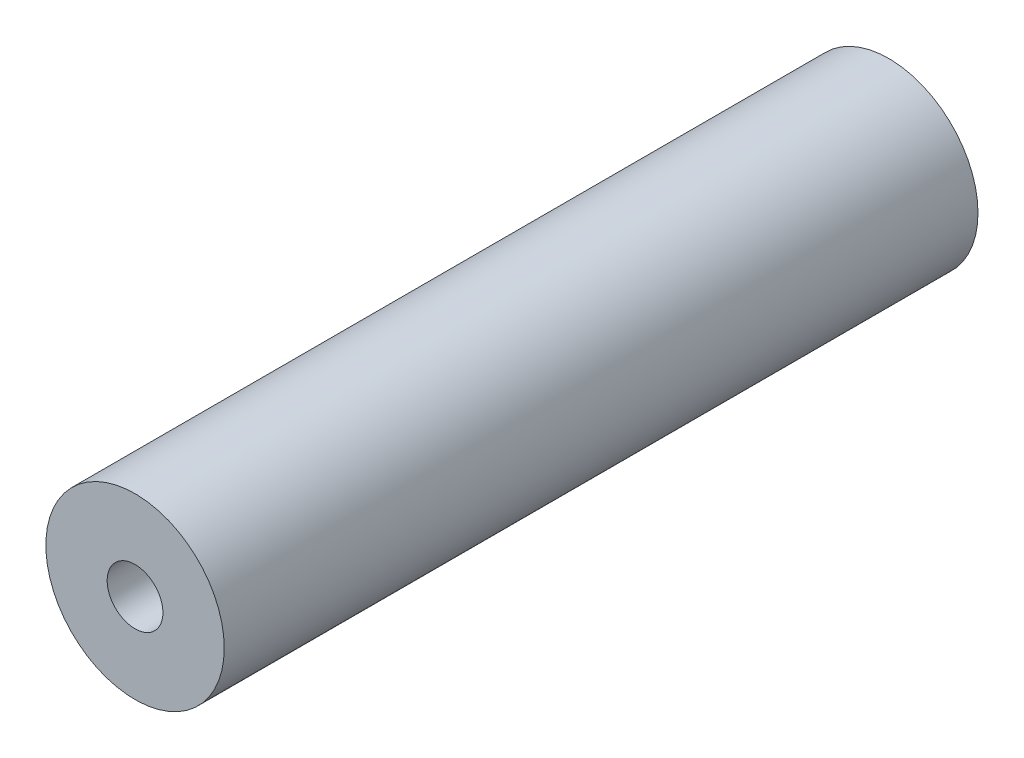
ISO-10303-21;
HEADER;
FILE_DESCRIPTION(('STEP AP214'),'2;1');
FILE_NAME('part.step','',(''),(''),'','','');
FILE_SCHEMA(('AUTOMOTIVE_DESIGN { 1 0 10303 214 1 1 1 1 }'));
ENDSEC;
DATA;
#1=APPLICATION_CONTEXT('core data for automotive mechanical design processes');
#2=APPLICATION_PROTOCOL_DEFINITION('international standard','automotive_design',2000,#1);
#3=PRODUCT_CONTEXT('',#1,'mechanical');
#4=PRODUCT('Part','Part','',(#3));
#5=PRODUCT_RELATED_PRODUCT_CATEGORY('part','',(#4));
#6=PRODUCT_DEFINITION_FORMATION('','',#4);
#7=PRODUCT_DEFINITION_CONTEXT('part definition',#1,'design');
#8=PRODUCT_DEFINITION('design','',#6,#7);
#9=PRODUCT_DEFINITION_SHAPE('','',#8);
#10=(LENGTH_UNIT() NAMED_UNIT(*) SI_UNIT(.MILLI.,.METRE.));
#11=(NAMED_UNIT(*) PLANE_ANGLE_UNIT() SI_UNIT($,.RADIAN.));
#12=(NAMED_UNIT(*) SI_UNIT($,.STERADIAN.) SOLID_ANGLE_UNIT());
#13=UNCERTAINTY_MEASURE_WITH_UNIT(LENGTH_MEASURE(1.E-05),#10,'distance_accuracy_value','');
#14=(GEOMETRIC_REPRESENTATION_CONTEXT(3) GLOBAL_UNCERTAINTY_ASSIGNED_CONTEXT((#13)) GLOBAL_UNIT_ASSIGNED_CONTEXT((#10,
#11,#12)) REPRESENTATION_CONTEXT('',''));
#15=CARTESIAN_POINT('',(0.,0.,0.));
#16=DIRECTION('',(0.,0.,1.));
#17=DIRECTION('',(1.,0.,0.));
#18=AXIS2_PLACEMENT_3D('',#15,#16,#17);
#19=CARTESIAN_POINT('',(0.,0.,33.8));
#20=DIRECTION('',(0.,0.,-1.));
#21=DIRECTION('',(-1.,0.,0.));
#22=AXIS2_PLACEMENT_3D('',#19,#20,#21);
#23=CYLINDRICAL_SURFACE('',#22,4.);
#24=CARTESIAN_POINT('',(0.,0.,33.8));
#25=DIRECTION('',(0.,0.,1.));
#26=DIRECTION('',(1.,0.,0.));
#27=AXIS2_PLACEMENT_3D('',#24,#25,#26);
#28=CIRCLE('',#27,4.);
#29=CARTESIAN_POINT('',(4.,0.,33.8));
#30=VERTEX_POINT('',#29);
#31=EDGE_CURVE('E10',#30,#30,#28,.T.);
#32=ORIENTED_EDGE('',*,*,#31,.F.);
#33=EDGE_LOOP('',(#32));
#34=FACE_BOUND('',#33,.T.);
#35=CARTESIAN_POINT('',(0.,0.,0.));
#36=DIRECTION('',(0.,0.,1.));
#37=DIRECTION('',(1.,0.,0.));
#38=AXIS2_PLACEMENT_3D('',#35,#36,#37);
#39=CIRCLE('',#38,4.);
#40=CARTESIAN_POINT('',(4.,0.,0.));
#41=VERTEX_POINT('',#40);
#42=EDGE_CURVE('E46',#41,#41,#39,.T.);
#43=ORIENTED_EDGE('',*,*,#42,.T.);
#44=EDGE_LOOP('',(#43));
#45=FACE_BOUND('',#44,.T.);
#46=ADVANCED_FACE('F43',(#34,#45),#23,.T.);
#47=CARTESIAN_POINT('',(0.,0.,33.8));
#48=DIRECTION('',(0.,0.,1.));
#49=DIRECTION('',(1.,0.,0.));
#50=AXIS2_PLACEMENT_3D('',#47,#48,#49);
#51=PLANE('',#50);
#52=CARTESIAN_POINT('',(0.,0.,33.8));
#53=DIRECTION('',(0.,0.,1.));
#54=DIRECTION('',(1.,0.,0.));
#55=AXIS2_PLACEMENT_3D('',#52,#53,#54);
#56=CIRCLE('',#55,1.24999999999999);
#57=CARTESIAN_POINT('',(1.24999999999999,0.,33.8));
#58=VERTEX_POINT('',#57);
#59=EDGE_CURVE('E60',#58,#58,#56,.T.);
#60=ORIENTED_EDGE('',*,*,#59,.F.);
#61=EDGE_LOOP('',(#60));
#62=FACE_BOUND('',#61,.T.);
#63=ORIENTED_EDGE('',*,*,#31,.T.);
#64=EDGE_LOOP('',(#63));
#65=FACE_BOUND('',#64,.T.);
#66=ADVANCED_FACE('F67',(#62,#65),#51,.T.);
#67=CARTESIAN_POINT('',(0.,0.,0.));
#68=DIRECTION('',(0.,0.,1.));
#69=DIRECTION('',(1.,0.,0.));
#70=AXIS2_PLACEMENT_3D('',#67,#68,#69);
#71=PLANE('',#70);
#72=CARTESIAN_POINT('',(0.,0.,0.));
#73=DIRECTION('',(0.,0.,1.));
#74=DIRECTION('',(1.,0.,0.));
#75=AXIS2_PLACEMENT_3D('',#72,#73,#74);
#76=CIRCLE('',#75,1.24999999999998);
#77=CARTESIAN_POINT('',(1.24999999999998,0.,0.));
#78=VERTEX_POINT('',#77);
#79=EDGE_CURVE('E55',#78,#78,#76,.T.);
#80=ORIENTED_EDGE('',*,*,#79,.T.);
#81=EDGE_LOOP('',(#80));
#82=FACE_BOUND('',#81,.T.);
#83=ORIENTED_EDGE('',*,*,#42,.F.);
#84=EDGE_LOOP('',(#83));
#85=FACE_BOUND('',#84,.T.);
#86=ADVANCED_FACE('F69',(#82,#85),#71,.F.);
#87=CARTESIAN_POINT('',(0.,0.,33.8));
#88=DIRECTION('',(0.,0.,1.));
#89=DIRECTION('',(1.,0.,0.));
#90=AXIS2_PLACEMENT_3D('',#87,#88,#89);
#91=CYLINDRICAL_SURFACE('',#90,1.24999999999999);
#92=ORIENTED_EDGE('',*,*,#79,.F.);
#93=EDGE_LOOP('',(#92));
#94=FACE_BOUND('',#93,.T.);
#95=ORIENTED_EDGE('',*,*,#59,.T.);
#96=EDGE_LOOP('',(#95));
#97=FACE_BOUND('',#96,.T.);
#98=ADVANCED_FACE('F65',(#94,#97),#91,.F.);
#99=CLOSED_SHELL('',(#46,#66,#86,#98));
#100=MANIFOLD_SOLID_BREP('B2',#99);
#101=ADVANCED_BREP_SHAPE_REPRESENTATION('',(#18,#100),#14);
#102=SHAPE_DEFINITION_REPRESENTATION(#9,#101);
ENDSEC;
END-ISO-10303-21;
